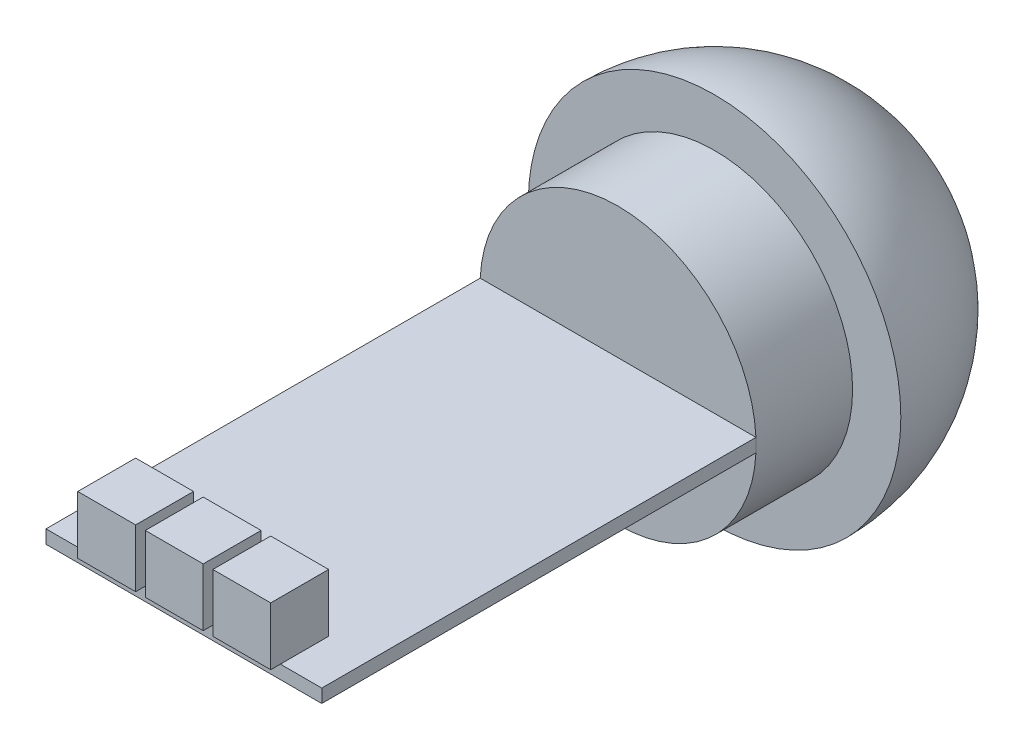
ISO-10303-21;
HEADER;
FILE_DESCRIPTION(('STEP AP214'),'2;1');
FILE_NAME('part.step','',(''),(''),'','','');
FILE_SCHEMA(('AUTOMOTIVE_DESIGN { 1 0 10303 214 1 1 1 1 }'));
ENDSEC;
DATA;
#1=APPLICATION_CONTEXT('core data for automotive mechanical design processes');
#2=APPLICATION_PROTOCOL_DEFINITION('international standard','automotive_design',2000,#1);
#3=PRODUCT_CONTEXT('',#1,'mechanical');
#4=PRODUCT('Part','Part','',(#3));
#5=PRODUCT_RELATED_PRODUCT_CATEGORY('part','',(#4));
#6=PRODUCT_DEFINITION_FORMATION('','',#4);
#7=PRODUCT_DEFINITION_CONTEXT('part definition',#1,'design');
#8=PRODUCT_DEFINITION('design','',#6,#7);
#9=PRODUCT_DEFINITION_SHAPE('','',#8);
#10=(LENGTH_UNIT() NAMED_UNIT(*) SI_UNIT(.MILLI.,.METRE.));
#11=(NAMED_UNIT(*) PLANE_ANGLE_UNIT() SI_UNIT($,.RADIAN.));
#12=(NAMED_UNIT(*) SI_UNIT($,.STERADIAN.) SOLID_ANGLE_UNIT());
#13=UNCERTAINTY_MEASURE_WITH_UNIT(LENGTH_MEASURE(1.E-05),#10,'distance_accuracy_value','');
#14=(GEOMETRIC_REPRESENTATION_CONTEXT(3) GLOBAL_UNCERTAINTY_ASSIGNED_CONTEXT((#13)) GLOBAL_UNIT_ASSIGNED_CONTEXT((#10,
#11,#12)) REPRESENTATION_CONTEXT('',''));
#15=CARTESIAN_POINT('',(0.,0.,0.));
#16=DIRECTION('',(0.,0.,1.));
#17=DIRECTION('',(1.,0.,0.));
#18=AXIS2_PLACEMENT_3D('',#15,#16,#17);
#19=CARTESIAN_POINT('',(-14.2895164825663,0.695015393121031,55.));
#20=DIRECTION('',(0.,-1.,0.));
#21=DIRECTION('',(0.,0.,-1.));
#22=AXIS2_PLACEMENT_3D('',#19,#20,#21);
#23=PLANE('',#22);
#24=DIRECTION('',(0.,0.,1.));
#25=VECTOR('',#24,1.);
#26=CARTESIAN_POINT('',(-10.,0.695015393121031,50.));
#27=LINE('',#26,#25);
#28=CARTESIAN_POINT('',(-10.,0.695015393121031,50.));
#29=VERTEX_POINT('',#28);
#30=CARTESIAN_POINT('',(-10.,0.695015393121031,55.));
#31=VERTEX_POINT('',#30);
#32=EDGE_CURVE('E52',#29,#31,#27,.T.);
#33=ORIENTED_EDGE('',*,*,#32,.F.);
#34=DIRECTION('',(-1.,0.,0.));
#35=VECTOR('',#34,1.);
#36=CARTESIAN_POINT('',(-10.,0.695015393121031,50.));
#37=LINE('',#36,#35);
#38=CARTESIAN_POINT('',(-4.00000000000001,0.695015393121031,50.));
#39=VERTEX_POINT('',#38);
#40=EDGE_CURVE('E187',#39,#29,#37,.T.);
#41=ORIENTED_EDGE('',*,*,#40,.F.);
#42=DIRECTION('',(0.,0.,-1.));
#43=VECTOR('',#42,1.);
#44=CARTESIAN_POINT('',(-4.00000000000001,0.695015393121031,50.));
#45=LINE('',#44,#43);
#46=CARTESIAN_POINT('',(-4.00000000000001,0.695015393121031,55.));
#47=VERTEX_POINT('',#46);
#48=EDGE_CURVE('E618',#47,#39,#45,.T.);
#49=ORIENTED_EDGE('',*,*,#48,.F.);
#50=DIRECTION('',(-1.,0.,0.));
#51=VECTOR('',#50,1.);
#52=CARTESIAN_POINT('',(-14.2895164825663,0.695015393121031,55.));
#53=LINE('',#52,#51);
#54=CARTESIAN_POINT('',(-3.00000000000001,0.695015393121031,55.));
#55=VERTEX_POINT('',#54);
#56=EDGE_CURVE('E629',#55,#47,#53,.T.);
#57=ORIENTED_EDGE('',*,*,#56,.F.);
#58=DIRECTION('',(0.,0.,1.));
#59=VECTOR('',#58,1.);
#60=CARTESIAN_POINT('',(-3.00000000000001,0.695015393121031,50.));
#61=LINE('',#60,#59);
#62=CARTESIAN_POINT('',(-3.00000000000001,0.695015393121031,50.));
#63=VERTEX_POINT('',#62);
#64=EDGE_CURVE('E239',#63,#55,#61,.T.);
#65=ORIENTED_EDGE('',*,*,#64,.F.);
#66=DIRECTION('',(-1.,0.,0.));
#67=VECTOR('',#66,1.);
#68=CARTESIAN_POINT('',(-3.00000000000001,0.695015393121031,50.));
#69=LINE('',#68,#67);
#70=CARTESIAN_POINT('',(3.00000000000001,0.695015393121031,50.));
#71=VERTEX_POINT('',#70);
#72=EDGE_CURVE('E232',#71,#63,#69,.T.);
#73=ORIENTED_EDGE('',*,*,#72,.F.);
#74=DIRECTION('',(0.,0.,-1.));
#75=VECTOR('',#74,1.);
#76=CARTESIAN_POINT('',(3.00000000000001,0.695015393121031,50.));
#77=LINE('',#76,#75);
#78=CARTESIAN_POINT('',(3.,0.695015393121031,55.));
#79=VERTEX_POINT('',#78);
#80=EDGE_CURVE('E243',#79,#71,#77,.T.);
#81=ORIENTED_EDGE('',*,*,#80,.F.);
#82=CARTESIAN_POINT('',(4.00000000000001,0.695015393121031,55.));
#83=VERTEX_POINT('',#82);
#84=EDGE_CURVE('E632',#83,#79,#53,.T.);
#85=ORIENTED_EDGE('',*,*,#84,.F.);
#86=DIRECTION('',(0.,0.,1.));
#87=VECTOR('',#86,1.);
#88=CARTESIAN_POINT('',(4.00000000000001,0.695015393121031,50.));
#89=LINE('',#88,#87);
#90=CARTESIAN_POINT('',(4.00000000000001,0.695015393121031,50.));
#91=VERTEX_POINT('',#90);
#92=EDGE_CURVE('E60',#91,#83,#89,.T.);
#93=ORIENTED_EDGE('',*,*,#92,.F.);
#94=DIRECTION('',(-1.,0.,0.));
#95=VECTOR('',#94,1.);
#96=CARTESIAN_POINT('',(4.00000000000001,0.695015393121031,50.));
#97=LINE('',#96,#95);
#98=CARTESIAN_POINT('',(10.,0.695015393121031,50.));
#99=VERTEX_POINT('',#98);
#100=EDGE_CURVE('E203',#99,#91,#97,.T.);
#101=ORIENTED_EDGE('',*,*,#100,.F.);
#102=DIRECTION('',(0.,0.,-1.));
#103=VECTOR('',#102,1.);
#104=CARTESIAN_POINT('',(10.,0.695015393121031,50.));
#105=LINE('',#104,#103);
#106=CARTESIAN_POINT('',(10.,0.695015393121031,55.));
#107=VERTEX_POINT('',#106);
#108=EDGE_CURVE('E212',#107,#99,#105,.T.);
#109=ORIENTED_EDGE('',*,*,#108,.F.);
#110=CARTESIAN_POINT('',(14.2895164825663,0.695015393121031,55.));
#111=VERTEX_POINT('',#110);
#112=EDGE_CURVE('E265',#111,#107,#53,.T.);
#113=ORIENTED_EDGE('',*,*,#112,.F.);
#114=DIRECTION('',(0.,0.,-1.));
#115=VECTOR('',#114,1.);
#116=CARTESIAN_POINT('',(14.2895164825663,0.695015393121031,55.));
#117=LINE('',#116,#115);
#118=CARTESIAN_POINT('',(14.2895164825663,0.695015393121031,10.));
#119=VERTEX_POINT('',#118);
#120=EDGE_CURVE('E293',#111,#119,#117,.T.);
#121=ORIENTED_EDGE('',*,*,#120,.T.);
#122=DIRECTION('',(-1.,0.,0.));
#123=VECTOR('',#122,1.);
#124=CARTESIAN_POINT('',(-14.2895164825663,0.695015393121031,10.));
#125=LINE('',#124,#123);
#126=CARTESIAN_POINT('',(-14.2895164825663,0.695015393121031,10.));
#127=VERTEX_POINT('',#126);
#128=EDGE_CURVE('E277',#119,#127,#125,.T.);
#129=ORIENTED_EDGE('',*,*,#128,.T.);
#130=DIRECTION('',(0.,0.,-1.));
#131=VECTOR('',#130,1.);
#132=CARTESIAN_POINT('',(-14.2895164825663,0.695015393121031,55.));
#133=LINE('',#132,#131);
#134=CARTESIAN_POINT('',(-14.2895164825663,0.695015393121031,55.));
#135=VERTEX_POINT('',#134);
#136=EDGE_CURVE('E290',#135,#127,#133,.T.);
#137=ORIENTED_EDGE('',*,*,#136,.F.);
#138=EDGE_CURVE('E263',#31,#135,#53,.T.);
#139=ORIENTED_EDGE('',*,*,#138,.F.);
#140=EDGE_LOOP('',(#33,#41,#49,#57,#65,#73,#81,#85,#93,#101,#109,#113,#121,#129,#137,#139));
#141=FACE_BOUND('',#140,.T.);
#142=ADVANCED_FACE('F37',(#141),#23,.F.);
#143=CARTESIAN_POINT('',(0.,0.,10.));
#144=DIRECTION('',(0.,0.,1.));
#145=DIRECTION('',(1.,0.,0.));
#146=AXIS2_PLACEMENT_3D('',#143,#144,#145);
#147=PLANE('',#146);
#148=DIRECTION('',(0.,1.,0.));
#149=VECTOR('',#148,1.);
#150=CARTESIAN_POINT('',(14.2895164825663,-0.695015393121031,10.));
#151=LINE('',#150,#149);
#152=CARTESIAN_POINT('',(14.2895164825663,-0.695015393121031,10.));
#153=VERTEX_POINT('',#152);
#154=EDGE_CURVE('E259',#153,#119,#151,.T.);
#155=ORIENTED_EDGE('',*,*,#154,.F.);
#156=CARTESIAN_POINT('',(0.,0.,10.));
#157=DIRECTION('',(0.,0.,1.));
#158=DIRECTION('',(1.,0.,0.));
#159=AXIS2_PLACEMENT_3D('',#156,#157,#158);
#160=CIRCLE('',#159,14.3064086234879);
#161=EDGE_CURVE('E298',#153,#119,#160,.T.);
#162=ORIENTED_EDGE('',*,*,#161,.T.);
#163=EDGE_LOOP('',(#155,#162));
#164=FACE_BOUND('',#163,.T.);
#165=ADVANCED_FACE('F346',(#164),#147,.T.);
#166=DIRECTION('',(1.,0.,0.));
#167=VECTOR('',#166,1.);
#168=CARTESIAN_POINT('',(-14.2895164825663,-0.695015393121031,10.));
#169=LINE('',#168,#167);
#170=CARTESIAN_POINT('',(-14.2895164825663,-0.695015393121005,10.));
#171=VERTEX_POINT('',#170);
#172=EDGE_CURVE('E264',#171,#153,#169,.T.);
#173=ORIENTED_EDGE('',*,*,#172,.F.);
#174=EDGE_CURVE('E303',#171,#153,#160,.T.);
#175=ORIENTED_EDGE('',*,*,#174,.T.);
#176=EDGE_LOOP('',(#173,#175));
#177=FACE_BOUND('',#176,.T.);
#178=ADVANCED_FACE('F353',(#177),#147,.T.);
#179=DIRECTION('',(0.,-1.,0.));
#180=VECTOR('',#179,1.);
#181=CARTESIAN_POINT('',(-14.2895164825663,-0.695015393121031,10.));
#182=LINE('',#181,#180);
#183=EDGE_CURVE('E280',#127,#171,#182,.T.);
#184=ORIENTED_EDGE('',*,*,#183,.F.);
#185=EDGE_CURVE('E297',#127,#171,#160,.T.);
#186=ORIENTED_EDGE('',*,*,#185,.T.);
#187=EDGE_LOOP('',(#184,#186));
#188=FACE_BOUND('',#187,.T.);
#189=ADVANCED_FACE('F314',(#188),#147,.T.);
#190=CARTESIAN_POINT('',(0.,0.,0.));
#191=DIRECTION('',(0.,0.,1.));
#192=DIRECTION('',(1.,0.,0.));
#193=AXIS2_PLACEMENT_3D('',#190,#191,#192);
#194=SPHERICAL_SURFACE('',#193,19.3064086234879);
#195=CARTESIAN_POINT('',(0.,0.,0.));
#196=DIRECTION('',(0.,0.,1.));
#197=DIRECTION('',(1.,0.,0.));
#198=AXIS2_PLACEMENT_3D('',#195,#196,#197);
#199=CIRCLE('',#198,19.3064086234879);
#200=CARTESIAN_POINT('',(19.3064086234879,0.,0.));
#201=VERTEX_POINT('',#200);
#202=EDGE_CURVE('E11',#201,#201,#199,.T.);
#203=ORIENTED_EDGE('',*,*,#202,.F.);
#204=EDGE_LOOP('',(#203));
#205=FACE_BOUND('',#204,.T.);
#206=ADVANCED_FACE('F39',(#205),#194,.T.);
#207=CARTESIAN_POINT('',(19.3064086234879,0.,0.));
#208=DIRECTION('',(0.,0.,1.));
#209=DIRECTION('',(1.,0.,0.));
#210=AXIS2_PLACEMENT_3D('',#207,#208,#209);
#211=PLANE('',#210);
#212=CARTESIAN_POINT('',(0.,0.,0.));
#213=DIRECTION('',(0.,0.,1.));
#214=DIRECTION('',(1.,0.,0.));
#215=AXIS2_PLACEMENT_3D('',#212,#213,#214);
#216=CIRCLE('',#215,14.3064086234879);
#217=CARTESIAN_POINT('',(14.3064086234879,0.,0.));
#218=VERTEX_POINT('',#217);
#219=EDGE_CURVE('E296',#218,#218,#216,.T.);
#220=ORIENTED_EDGE('',*,*,#219,.F.);
#221=EDGE_LOOP('',(#220));
#222=FACE_BOUND('',#221,.T.);
#223=ORIENTED_EDGE('',*,*,#202,.T.);
#224=EDGE_LOOP('',(#223));
#225=FACE_BOUND('',#224,.T.);
#226=ADVANCED_FACE('F338',(#222,#225),#211,.T.);
#227=CARTESIAN_POINT('',(0.,0.,10.));
#228=DIRECTION('',(0.,0.,-1.));
#229=DIRECTION('',(-1.,0.,0.));
#230=AXIS2_PLACEMENT_3D('',#227,#228,#229);
#231=CYLINDRICAL_SURFACE('',#230,14.3064086234879);
#232=EDGE_CURVE('E45',#119,#127,#160,.T.);
#233=ORIENTED_EDGE('',*,*,#232,.F.);
#234=ORIENTED_EDGE('',*,*,#161,.F.);
#235=ORIENTED_EDGE('',*,*,#174,.F.);
#236=ORIENTED_EDGE('',*,*,#185,.F.);
#237=EDGE_LOOP('',(#233,#234,#235,#236));
#238=FACE_BOUND('',#237,.T.);
#239=ORIENTED_EDGE('',*,*,#219,.T.);
#240=EDGE_LOOP('',(#239));
#241=FACE_BOUND('',#240,.T.);
#242=ADVANCED_FACE('F336',(#238,#241),#231,.T.);
#243=ORIENTED_EDGE('',*,*,#128,.F.);
#244=ORIENTED_EDGE('',*,*,#232,.T.);
#245=EDGE_LOOP('',(#243,#244));
#246=FACE_BOUND('',#245,.T.);
#247=ADVANCED_FACE('F335',(#246),#147,.T.);
#248=CARTESIAN_POINT('',(14.2895164825663,-0.695015393121031,55.));
#249=DIRECTION('',(-1.,0.,0.));
#250=DIRECTION('',(0.,0.,1.));
#251=AXIS2_PLACEMENT_3D('',#248,#249,#250);
#252=PLANE('',#251);
#253=ORIENTED_EDGE('',*,*,#154,.T.);
#254=ORIENTED_EDGE('',*,*,#120,.F.);
#255=DIRECTION('',(0.,1.,0.));
#256=VECTOR('',#255,1.);
#257=CARTESIAN_POINT('',(14.2895164825663,-0.695015393121031,55.));
#258=LINE('',#257,#256);
#259=CARTESIAN_POINT('',(14.2895164825663,-0.695015393121031,55.));
#260=VERTEX_POINT('',#259);
#261=EDGE_CURVE('E260',#260,#111,#258,.T.);
#262=ORIENTED_EDGE('',*,*,#261,.F.);
#263=DIRECTION('',(0.,0.,-1.));
#264=VECTOR('',#263,1.);
#265=CARTESIAN_POINT('',(14.2895164825663,-0.695015393121031,55.));
#266=LINE('',#265,#264);
#267=EDGE_CURVE('E274',#260,#153,#266,.T.);
#268=ORIENTED_EDGE('',*,*,#267,.T.);
#269=EDGE_LOOP('',(#253,#254,#262,#268));
#270=FACE_BOUND('',#269,.T.);
#271=ADVANCED_FACE('F344',(#270),#252,.F.);
#272=CARTESIAN_POINT('',(-14.2895164825663,-0.695015393121031,55.));
#273=DIRECTION('',(1.,0.,0.));
#274=DIRECTION('',(0.,0.,-1.));
#275=AXIS2_PLACEMENT_3D('',#272,#273,#274);
#276=PLANE('',#275);
#277=ORIENTED_EDGE('',*,*,#183,.T.);
#278=DIRECTION('',(0.,0.,-1.));
#279=VECTOR('',#278,1.);
#280=CARTESIAN_POINT('',(-14.2895164825663,-0.695015393121031,55.));
#281=LINE('',#280,#279);
#282=CARTESIAN_POINT('',(-14.2895164825663,-0.695015393121031,55.));
#283=VERTEX_POINT('',#282);
#284=EDGE_CURVE('E287',#283,#171,#281,.T.);
#285=ORIENTED_EDGE('',*,*,#284,.F.);
#286=DIRECTION('',(0.,-1.,0.));
#287=VECTOR('',#286,1.);
#288=CARTESIAN_POINT('',(-14.2895164825663,-0.695015393121031,55.));
#289=LINE('',#288,#287);
#290=EDGE_CURVE('E268',#135,#283,#289,.T.);
#291=ORIENTED_EDGE('',*,*,#290,.F.);
#292=ORIENTED_EDGE('',*,*,#136,.T.);
#293=EDGE_LOOP('',(#277,#285,#291,#292));
#294=FACE_BOUND('',#293,.T.);
#295=ADVANCED_FACE('F318',(#294),#276,.F.);
#296=CARTESIAN_POINT('',(-14.2895164825663,-0.695015393121031,55.));
#297=DIRECTION('',(0.,1.,0.));
#298=DIRECTION('',(0.,0.,1.));
#299=AXIS2_PLACEMENT_3D('',#296,#297,#298);
#300=PLANE('',#299);
#301=ORIENTED_EDGE('',*,*,#172,.T.);
#302=ORIENTED_EDGE('',*,*,#267,.F.);
#303=DIRECTION('',(1.,0.,0.));
#304=VECTOR('',#303,1.);
#305=CARTESIAN_POINT('',(-14.2895164825663,-0.695015393121031,55.));
#306=LINE('',#305,#304);
#307=EDGE_CURVE('E272',#283,#260,#306,.T.);
#308=ORIENTED_EDGE('',*,*,#307,.F.);
#309=ORIENTED_EDGE('',*,*,#284,.T.);
#310=EDGE_LOOP('',(#301,#302,#308,#309));
#311=FACE_BOUND('',#310,.T.);
#312=ADVANCED_FACE('F323',(#311),#300,.F.);
#313=CARTESIAN_POINT('',(0.,0.,55.));
#314=DIRECTION('',(0.,0.,-1.));
#315=DIRECTION('',(-1.,0.,0.));
#316=AXIS2_PLACEMENT_3D('',#313,#314,#315);
#317=PLANE('',#316);
#318=ORIENTED_EDGE('',*,*,#261,.T.);
#319=ORIENTED_EDGE('',*,*,#112,.T.);
#320=EDGE_CURVE('E269',#107,#83,#53,.T.);
#321=ORIENTED_EDGE('',*,*,#320,.T.);
#322=ORIENTED_EDGE('',*,*,#84,.T.);
#323=EDGE_CURVE('E270',#79,#55,#53,.T.);
#324=ORIENTED_EDGE('',*,*,#323,.T.);
#325=ORIENTED_EDGE('',*,*,#56,.T.);
#326=EDGE_CURVE('E332',#47,#31,#53,.T.);
#327=ORIENTED_EDGE('',*,*,#326,.T.);
#328=ORIENTED_EDGE('',*,*,#138,.T.);
#329=ORIENTED_EDGE('',*,*,#290,.T.);
#330=ORIENTED_EDGE('',*,*,#307,.T.);
#331=EDGE_LOOP('',(#318,#319,#321,#322,#324,#325,#327,#328,#329,#330));
#332=FACE_BOUND('',#331,.T.);
#333=ADVANCED_FACE('F327',(#332),#317,.F.);
#334=CARTESIAN_POINT('',(0.,0.695015393121031,0.));
#335=DIRECTION('',(0.,1.,0.));
#336=DIRECTION('',(0.,0.,1.));
#337=AXIS2_PLACEMENT_3D('',#334,#335,#336);
#338=PLANE('',#337);
#339=CARTESIAN_POINT('',(-3.00000000000001,0.695015393121031,56.));
#340=VERTEX_POINT('',#339);
#341=EDGE_CURVE('E227',#55,#340,#61,.T.);
#342=ORIENTED_EDGE('',*,*,#341,.F.);
#343=ORIENTED_EDGE('',*,*,#323,.F.);
#344=CARTESIAN_POINT('',(3.,0.695015393121031,56.));
#345=VERTEX_POINT('',#344);
#346=EDGE_CURVE('E244',#345,#79,#77,.T.);
#347=ORIENTED_EDGE('',*,*,#346,.F.);
#348=DIRECTION('',(1.,0.,0.));
#349=VECTOR('',#348,1.);
#350=CARTESIAN_POINT('',(-3.00000000000001,0.695015393121031,56.));
#351=LINE('',#350,#349);
#352=EDGE_CURVE('E241',#340,#345,#351,.T.);
#353=ORIENTED_EDGE('',*,*,#352,.F.);
#354=EDGE_LOOP('',(#342,#343,#347,#353));
#355=FACE_BOUND('',#354,.T.);
#356=ADVANCED_FACE('F368',(#355),#338,.F.);
#357=CARTESIAN_POINT('',(-3.00000000000001,6.69501539312103,50.));
#358=DIRECTION('',(1.,0.,0.));
#359=DIRECTION('',(0.,0.,-1.));
#360=AXIS2_PLACEMENT_3D('',#357,#358,#359);
#361=PLANE('',#360);
#362=ORIENTED_EDGE('',*,*,#64,.T.);
#363=ORIENTED_EDGE('',*,*,#341,.T.);
#364=DIRECTION('',(0.,-1.,0.));
#365=VECTOR('',#364,1.);
#366=CARTESIAN_POINT('',(-3.00000000000001,6.69501539312103,56.));
#367=LINE('',#366,#365);
#368=CARTESIAN_POINT('',(-3.00000000000001,6.69501539312103,56.));
#369=VERTEX_POINT('',#368);
#370=EDGE_CURVE('E256',#369,#340,#367,.T.);
#371=ORIENTED_EDGE('',*,*,#370,.F.);
#372=DIRECTION('',(0.,0.,1.));
#373=VECTOR('',#372,1.);
#374=CARTESIAN_POINT('',(-3.00000000000001,6.69501539312103,50.));
#375=LINE('',#374,#373);
#376=CARTESIAN_POINT('',(-3.00000000000001,6.69501539312103,50.));
#377=VERTEX_POINT('',#376);
#378=EDGE_CURVE('E228',#377,#369,#375,.T.);
#379=ORIENTED_EDGE('',*,*,#378,.F.);
#380=DIRECTION('',(0.,-1.,0.));
#381=VECTOR('',#380,1.);
#382=CARTESIAN_POINT('',(-3.00000000000001,6.69501539312103,50.));
#383=LINE('',#382,#381);
#384=EDGE_CURVE('E238',#377,#63,#383,.T.);
#385=ORIENTED_EDGE('',*,*,#384,.T.);
#386=EDGE_LOOP('',(#362,#363,#371,#379,#385));
#387=FACE_BOUND('',#386,.T.);
#388=ADVANCED_FACE('F371',(#387),#361,.F.);
#389=CARTESIAN_POINT('',(-3.00000000000001,6.69501539312103,56.));
#390=DIRECTION('',(0.,0.,-1.));
#391=DIRECTION('',(-1.,0.,0.));
#392=AXIS2_PLACEMENT_3D('',#389,#390,#391);
#393=PLANE('',#392);
#394=ORIENTED_EDGE('',*,*,#352,.T.);
#395=DIRECTION('',(0.,-1.,0.));
#396=VECTOR('',#395,1.);
#397=CARTESIAN_POINT('',(3.,6.69501539312103,56.));
#398=LINE('',#397,#396);
#399=CARTESIAN_POINT('',(3.,6.69501539312103,56.));
#400=VERTEX_POINT('',#399);
#401=EDGE_CURVE('E253',#400,#345,#398,.T.);
#402=ORIENTED_EDGE('',*,*,#401,.F.);
#403=DIRECTION('',(1.,0.,0.));
#404=VECTOR('',#403,1.);
#405=CARTESIAN_POINT('',(-3.00000000000001,6.69501539312103,56.));
#406=LINE('',#405,#404);
#407=EDGE_CURVE('E231',#369,#400,#406,.T.);
#408=ORIENTED_EDGE('',*,*,#407,.F.);
#409=ORIENTED_EDGE('',*,*,#370,.T.);
#410=EDGE_LOOP('',(#394,#402,#408,#409));
#411=FACE_BOUND('',#410,.T.);
#412=ADVANCED_FACE('F374',(#411),#393,.F.);
#413=CARTESIAN_POINT('',(3.00000000000001,6.69501539312103,50.));
#414=DIRECTION('',(-1.,0.,0.));
#415=DIRECTION('',(0.,0.,1.));
#416=AXIS2_PLACEMENT_3D('',#413,#414,#415);
#417=PLANE('',#416);
#418=ORIENTED_EDGE('',*,*,#346,.T.);
#419=ORIENTED_EDGE('',*,*,#80,.T.);
#420=DIRECTION('',(0.,-1.,0.));
#421=VECTOR('',#420,1.);
#422=CARTESIAN_POINT('',(3.00000000000001,6.69501539312103,50.));
#423=LINE('',#422,#421);
#424=CARTESIAN_POINT('',(3.00000000000001,6.69501539312103,50.));
#425=VERTEX_POINT('',#424);
#426=EDGE_CURVE('E250',#425,#71,#423,.T.);
#427=ORIENTED_EDGE('',*,*,#426,.F.);
#428=DIRECTION('',(0.,0.,-1.));
#429=VECTOR('',#428,1.);
#430=CARTESIAN_POINT('',(3.00000000000001,6.69501539312103,50.));
#431=LINE('',#430,#429);
#432=EDGE_CURVE('E234',#400,#425,#431,.T.);
#433=ORIENTED_EDGE('',*,*,#432,.F.);
#434=ORIENTED_EDGE('',*,*,#401,.T.);
#435=EDGE_LOOP('',(#418,#419,#427,#433,#434));
#436=FACE_BOUND('',#435,.T.);
#437=ADVANCED_FACE('F378',(#436),#417,.F.);
#438=CARTESIAN_POINT('',(-3.00000000000001,6.69501539312103,50.));
#439=DIRECTION('',(0.,0.,1.));
#440=DIRECTION('',(1.,0.,0.));
#441=AXIS2_PLACEMENT_3D('',#438,#439,#440);
#442=PLANE('',#441);
#443=ORIENTED_EDGE('',*,*,#72,.T.);
#444=ORIENTED_EDGE('',*,*,#384,.F.);
#445=DIRECTION('',(-1.,0.,0.));
#446=VECTOR('',#445,1.);
#447=CARTESIAN_POINT('',(-3.00000000000001,6.69501539312103,50.));
#448=LINE('',#447,#446);
#449=EDGE_CURVE('E236',#425,#377,#448,.T.);
#450=ORIENTED_EDGE('',*,*,#449,.F.);
#451=ORIENTED_EDGE('',*,*,#426,.T.);
#452=EDGE_LOOP('',(#443,#444,#450,#451));
#453=FACE_BOUND('',#452,.T.);
#454=ADVANCED_FACE('F382',(#453),#442,.F.);
#455=CARTESIAN_POINT('',(0.,6.69501539312103,0.));
#456=DIRECTION('',(0.,1.,0.));
#457=DIRECTION('',(0.,0.,1.));
#458=AXIS2_PLACEMENT_3D('',#455,#456,#457);
#459=PLANE('',#458);
#460=ORIENTED_EDGE('',*,*,#378,.T.);
#461=ORIENTED_EDGE('',*,*,#407,.T.);
#462=ORIENTED_EDGE('',*,*,#432,.T.);
#463=ORIENTED_EDGE('',*,*,#449,.T.);
#464=EDGE_LOOP('',(#460,#461,#462,#463));
#465=FACE_BOUND('',#464,.T.);
#466=ADVANCED_FACE('F386',(#465),#459,.T.);
#467=CARTESIAN_POINT('',(0.,0.695015393121031,0.));
#468=DIRECTION('',(0.,1.,0.));
#469=DIRECTION('',(0.,0.,1.));
#470=AXIS2_PLACEMENT_3D('',#467,#468,#469);
#471=PLANE('',#470);
#472=CARTESIAN_POINT('',(4.00000000000001,0.695015393121031,56.));
#473=VERTEX_POINT('',#472);
#474=EDGE_CURVE('E192',#83,#473,#89,.T.);
#475=ORIENTED_EDGE('',*,*,#474,.F.);
#476=ORIENTED_EDGE('',*,*,#320,.F.);
#477=CARTESIAN_POINT('',(10.,0.695015393121031,56.));
#478=VERTEX_POINT('',#477);
#479=EDGE_CURVE('E213',#478,#107,#105,.T.);
#480=ORIENTED_EDGE('',*,*,#479,.F.);
#481=DIRECTION('',(1.,0.,0.));
#482=VECTOR('',#481,1.);
#483=CARTESIAN_POINT('',(4.00000000000001,0.695015393121031,56.));
#484=LINE('',#483,#482);
#485=EDGE_CURVE('E210',#473,#478,#484,.T.);
#486=ORIENTED_EDGE('',*,*,#485,.F.);
#487=EDGE_LOOP('',(#475,#476,#480,#486));
#488=FACE_BOUND('',#487,.T.);
#489=ADVANCED_FACE('F393',(#488),#471,.F.);
#490=CARTESIAN_POINT('',(4.00000000000001,6.69501539312103,50.));
#491=DIRECTION('',(1.,0.,0.));
#492=DIRECTION('',(0.,0.,-1.));
#493=AXIS2_PLACEMENT_3D('',#490,#491,#492);
#494=PLANE('',#493);
#495=ORIENTED_EDGE('',*,*,#92,.T.);
#496=ORIENTED_EDGE('',*,*,#474,.T.);
#497=DIRECTION('',(0.,-1.,0.));
#498=VECTOR('',#497,1.);
#499=CARTESIAN_POINT('',(4.00000000000001,6.69501539312103,56.));
#500=LINE('',#499,#498);
#501=CARTESIAN_POINT('',(4.00000000000001,6.69501539312103,56.));
#502=VERTEX_POINT('',#501);
#503=EDGE_CURVE('E224',#502,#473,#500,.T.);
#504=ORIENTED_EDGE('',*,*,#503,.F.);
#505=DIRECTION('',(0.,0.,1.));
#506=VECTOR('',#505,1.);
#507=CARTESIAN_POINT('',(4.00000000000001,6.69501539312103,50.));
#508=LINE('',#507,#506);
#509=CARTESIAN_POINT('',(4.00000000000001,6.69501539312103,50.));
#510=VERTEX_POINT('',#509);
#511=EDGE_CURVE('E199',#510,#502,#508,.T.);
#512=ORIENTED_EDGE('',*,*,#511,.F.);
#513=DIRECTION('',(0.,-1.,0.));
#514=VECTOR('',#513,1.);
#515=CARTESIAN_POINT('',(4.00000000000001,6.69501539312103,50.));
#516=LINE('',#515,#514);
#517=EDGE_CURVE('E208',#510,#91,#516,.T.);
#518=ORIENTED_EDGE('',*,*,#517,.T.);
#519=EDGE_LOOP('',(#495,#496,#504,#512,#518));
#520=FACE_BOUND('',#519,.T.);
#521=ADVANCED_FACE('F395',(#520),#494,.F.);
#522=CARTESIAN_POINT('',(4.00000000000001,6.69501539312103,56.));
#523=DIRECTION('',(0.,0.,-1.));
#524=DIRECTION('',(-1.,0.,0.));
#525=AXIS2_PLACEMENT_3D('',#522,#523,#524);
#526=PLANE('',#525);
#527=ORIENTED_EDGE('',*,*,#485,.T.);
#528=DIRECTION('',(0.,-1.,0.));
#529=VECTOR('',#528,1.);
#530=CARTESIAN_POINT('',(10.,6.69501539312103,56.));
#531=LINE('',#530,#529);
#532=CARTESIAN_POINT('',(10.,6.69501539312103,56.));
#533=VERTEX_POINT('',#532);
#534=EDGE_CURVE('E221',#533,#478,#531,.T.);
#535=ORIENTED_EDGE('',*,*,#534,.F.);
#536=DIRECTION('',(1.,0.,0.));
#537=VECTOR('',#536,1.);
#538=CARTESIAN_POINT('',(4.00000000000001,6.69501539312103,56.));
#539=LINE('',#538,#537);
#540=EDGE_CURVE('E202',#502,#533,#539,.T.);
#541=ORIENTED_EDGE('',*,*,#540,.F.);
#542=ORIENTED_EDGE('',*,*,#503,.T.);
#543=EDGE_LOOP('',(#527,#535,#541,#542));
#544=FACE_BOUND('',#543,.T.);
#545=ADVANCED_FACE('F398',(#544),#526,.F.);
#546=CARTESIAN_POINT('',(10.,6.69501539312103,50.));
#547=DIRECTION('',(-1.,0.,0.));
#548=DIRECTION('',(0.,0.,1.));
#549=AXIS2_PLACEMENT_3D('',#546,#547,#548);
#550=PLANE('',#549);
#551=ORIENTED_EDGE('',*,*,#479,.T.);
#552=ORIENTED_EDGE('',*,*,#108,.T.);
#553=DIRECTION('',(0.,-1.,0.));
#554=VECTOR('',#553,1.);
#555=CARTESIAN_POINT('',(10.,6.69501539312103,50.));
#556=LINE('',#555,#554);
#557=CARTESIAN_POINT('',(10.,6.69501539312103,50.));
#558=VERTEX_POINT('',#557);
#559=EDGE_CURVE('E218',#558,#99,#556,.T.);
#560=ORIENTED_EDGE('',*,*,#559,.F.);
#561=DIRECTION('',(0.,0.,-1.));
#562=VECTOR('',#561,1.);
#563=CARTESIAN_POINT('',(10.,6.69501539312103,50.));
#564=LINE('',#563,#562);
#565=EDGE_CURVE('E205',#533,#558,#564,.T.);
#566=ORIENTED_EDGE('',*,*,#565,.F.);
#567=ORIENTED_EDGE('',*,*,#534,.T.);
#568=EDGE_LOOP('',(#551,#552,#560,#566,#567));
#569=FACE_BOUND('',#568,.T.);
#570=ADVANCED_FACE('F401',(#569),#550,.F.);
#571=CARTESIAN_POINT('',(4.00000000000001,6.69501539312103,50.));
#572=DIRECTION('',(0.,0.,1.));
#573=DIRECTION('',(1.,0.,0.));
#574=AXIS2_PLACEMENT_3D('',#571,#572,#573);
#575=PLANE('',#574);
#576=ORIENTED_EDGE('',*,*,#100,.T.);
#577=ORIENTED_EDGE('',*,*,#517,.F.);
#578=DIRECTION('',(-1.,0.,0.));
#579=VECTOR('',#578,1.);
#580=CARTESIAN_POINT('',(4.00000000000001,6.69501539312103,50.));
#581=LINE('',#580,#579);
#582=EDGE_CURVE('E207',#558,#510,#581,.T.);
#583=ORIENTED_EDGE('',*,*,#582,.F.);
#584=ORIENTED_EDGE('',*,*,#559,.T.);
#585=EDGE_LOOP('',(#576,#577,#583,#584));
#586=FACE_BOUND('',#585,.T.);
#587=ADVANCED_FACE('F405',(#586),#575,.F.);
#588=CARTESIAN_POINT('',(0.,6.69501539312103,0.));
#589=DIRECTION('',(0.,1.,0.));
#590=DIRECTION('',(0.,0.,1.));
#591=AXIS2_PLACEMENT_3D('',#588,#589,#590);
#592=PLANE('',#591);
#593=ORIENTED_EDGE('',*,*,#511,.T.);
#594=ORIENTED_EDGE('',*,*,#540,.T.);
#595=ORIENTED_EDGE('',*,*,#565,.T.);
#596=ORIENTED_EDGE('',*,*,#582,.T.);
#597=EDGE_LOOP('',(#593,#594,#595,#596));
#598=FACE_BOUND('',#597,.T.);
#599=ADVANCED_FACE('F409',(#598),#592,.T.);
#600=CARTESIAN_POINT('',(0.,0.695015393121031,0.));
#601=DIRECTION('',(0.,1.,0.));
#602=DIRECTION('',(0.,0.,1.));
#603=AXIS2_PLACEMENT_3D('',#600,#601,#602);
#604=PLANE('',#603);
#605=CARTESIAN_POINT('',(-10.,0.695015393121031,56.));
#606=VERTEX_POINT('',#605);
#607=EDGE_CURVE('E190',#31,#606,#27,.T.);
#608=ORIENTED_EDGE('',*,*,#607,.F.);
#609=ORIENTED_EDGE('',*,*,#326,.F.);
#610=CARTESIAN_POINT('',(-4.00000000000001,0.695015393121031,56.));
#611=VERTEX_POINT('',#610);
#612=EDGE_CURVE('E619',#611,#47,#45,.T.);
#613=ORIENTED_EDGE('',*,*,#612,.F.);
#614=DIRECTION('',(1.,0.,0.));
#615=VECTOR('',#614,1.);
#616=CARTESIAN_POINT('',(-10.,0.695015393121031,56.));
#617=LINE('',#616,#615);
#618=EDGE_CURVE('E612',#606,#611,#617,.T.);
#619=ORIENTED_EDGE('',*,*,#618,.F.);
#620=EDGE_LOOP('',(#608,#609,#613,#619));
#621=FACE_BOUND('',#620,.T.);
#622=ADVANCED_FACE('F416',(#621),#604,.F.);
#623=CARTESIAN_POINT('',(-10.,6.69501539312103,50.));
#624=DIRECTION('',(1.,0.,0.));
#625=DIRECTION('',(0.,0.,-1.));
#626=AXIS2_PLACEMENT_3D('',#623,#624,#625);
#627=PLANE('',#626);
#628=ORIENTED_EDGE('',*,*,#32,.T.);
#629=ORIENTED_EDGE('',*,*,#607,.T.);
#630=DIRECTION('',(0.,-1.,0.));
#631=VECTOR('',#630,1.);
#632=CARTESIAN_POINT('',(-10.,6.69501539312103,56.));
#633=LINE('',#632,#631);
#634=CARTESIAN_POINT('',(-10.,6.69501539312103,56.));
#635=VERTEX_POINT('',#634);
#636=EDGE_CURVE('E174',#635,#606,#633,.T.);
#637=ORIENTED_EDGE('',*,*,#636,.F.);
#638=DIRECTION('',(0.,0.,1.));
#639=VECTOR('',#638,1.);
#640=CARTESIAN_POINT('',(-10.,6.69501539312103,50.));
#641=LINE('',#640,#639);
#642=CARTESIAN_POINT('',(-10.,6.69501539312103,50.));
#643=VERTEX_POINT('',#642);
#644=EDGE_CURVE('E180',#643,#635,#641,.T.);
#645=ORIENTED_EDGE('',*,*,#644,.F.);
#646=DIRECTION('',(0.,-1.,0.));
#647=VECTOR('',#646,1.);
#648=CARTESIAN_POINT('',(-10.,6.69501539312103,50.));
#649=LINE('',#648,#647);
#650=EDGE_CURVE('E622',#643,#29,#649,.T.);
#651=ORIENTED_EDGE('',*,*,#650,.T.);
#652=EDGE_LOOP('',(#628,#629,#637,#645,#651));
#653=FACE_BOUND('',#652,.T.);
#654=ADVANCED_FACE('F189',(#653),#627,.F.);
#655=CARTESIAN_POINT('',(-10.,6.69501539312103,56.));
#656=DIRECTION('',(0.,0.,-1.));
#657=DIRECTION('',(-1.,0.,0.));
#658=AXIS2_PLACEMENT_3D('',#655,#656,#657);
#659=PLANE('',#658);
#660=ORIENTED_EDGE('',*,*,#618,.T.);
#661=DIRECTION('',(0.,-1.,0.));
#662=VECTOR('',#661,1.);
#663=CARTESIAN_POINT('',(-4.00000000000001,6.69501539312103,56.));
#664=LINE('',#663,#662);
#665=CARTESIAN_POINT('',(-4.00000000000001,6.69501539312103,56.));
#666=VERTEX_POINT('',#665);
#667=EDGE_CURVE('E176',#666,#611,#664,.T.);
#668=ORIENTED_EDGE('',*,*,#667,.F.);
#669=DIRECTION('',(1.,0.,0.));
#670=VECTOR('',#669,1.);
#671=CARTESIAN_POINT('',(-10.,6.69501539312103,56.));
#672=LINE('',#671,#670);
#673=EDGE_CURVE('E170',#635,#666,#672,.T.);
#674=ORIENTED_EDGE('',*,*,#673,.F.);
#675=ORIENTED_EDGE('',*,*,#636,.T.);
#676=EDGE_LOOP('',(#660,#668,#674,#675));
#677=FACE_BOUND('',#676,.T.);
#678=ADVANCED_FACE('F172',(#677),#659,.F.);
#679=CARTESIAN_POINT('',(-4.00000000000001,6.69501539312103,50.));
#680=DIRECTION('',(-1.,0.,0.));
#681=DIRECTION('',(0.,0.,1.));
#682=AXIS2_PLACEMENT_3D('',#679,#680,#681);
#683=PLANE('',#682);
#684=ORIENTED_EDGE('',*,*,#612,.T.);
#685=ORIENTED_EDGE('',*,*,#48,.T.);
#686=DIRECTION('',(0.,-1.,0.));
#687=VECTOR('',#686,1.);
#688=CARTESIAN_POINT('',(-4.00000000000001,6.69501539312103,50.));
#689=LINE('',#688,#687);
#690=CARTESIAN_POINT('',(-4.00000000000001,6.69501539312103,50.));
#691=VERTEX_POINT('',#690);
#692=EDGE_CURVE('E195',#691,#39,#689,.T.);
#693=ORIENTED_EDGE('',*,*,#692,.F.);
#694=DIRECTION('',(0.,0.,-1.));
#695=VECTOR('',#694,1.);
#696=CARTESIAN_POINT('',(-4.00000000000001,6.69501539312103,50.));
#697=LINE('',#696,#695);
#698=EDGE_CURVE('E179',#666,#691,#697,.T.);
#699=ORIENTED_EDGE('',*,*,#698,.F.);
#700=ORIENTED_EDGE('',*,*,#667,.T.);
#701=EDGE_LOOP('',(#684,#685,#693,#699,#700));
#702=FACE_BOUND('',#701,.T.);
#703=ADVANCED_FACE('F422',(#702),#683,.F.);
#704=CARTESIAN_POINT('',(-10.,6.69501539312103,50.));
#705=DIRECTION('',(0.,0.,1.));
#706=DIRECTION('',(1.,0.,0.));
#707=AXIS2_PLACEMENT_3D('',#704,#705,#706);
#708=PLANE('',#707);
#709=ORIENTED_EDGE('',*,*,#40,.T.);
#710=ORIENTED_EDGE('',*,*,#650,.F.);
#711=DIRECTION('',(-1.,0.,0.));
#712=VECTOR('',#711,1.);
#713=CARTESIAN_POINT('',(-10.,6.69501539312103,50.));
#714=LINE('',#713,#712);
#715=EDGE_CURVE('E185',#691,#643,#714,.T.);
#716=ORIENTED_EDGE('',*,*,#715,.F.);
#717=ORIENTED_EDGE('',*,*,#692,.T.);
#718=EDGE_LOOP('',(#709,#710,#716,#717));
#719=FACE_BOUND('',#718,.T.);
#720=ADVANCED_FACE('F425',(#719),#708,.F.);
#721=CARTESIAN_POINT('',(0.,6.69501539312103,0.));
#722=DIRECTION('',(0.,1.,0.));
#723=DIRECTION('',(0.,0.,1.));
#724=AXIS2_PLACEMENT_3D('',#721,#722,#723);
#725=PLANE('',#724);
#726=ORIENTED_EDGE('',*,*,#644,.T.);
#727=ORIENTED_EDGE('',*,*,#673,.T.);
#728=ORIENTED_EDGE('',*,*,#698,.T.);
#729=ORIENTED_EDGE('',*,*,#715,.T.);
#730=EDGE_LOOP('',(#726,#727,#728,#729));
#731=FACE_BOUND('',#730,.T.);
#732=ADVANCED_FACE('F183',(#731),#725,.T.);
#733=CLOSED_SHELL('',(#142,#165,#178,#189,#206,#226,#242,#247,#271,#295,#312,#333,#356,#388,
#412,#437,#454,#466,#489,#521,#545,#570,#587,#599,#622,#654,#678,#703,#720,#732));
#734=MANIFOLD_SOLID_BREP('B2',#733);
#735=ADVANCED_BREP_SHAPE_REPRESENTATION('',(#18,#734),#14);
#736=SHAPE_DEFINITION_REPRESENTATION(#9,#735);
ENDSEC;
END-ISO-10303-21;
